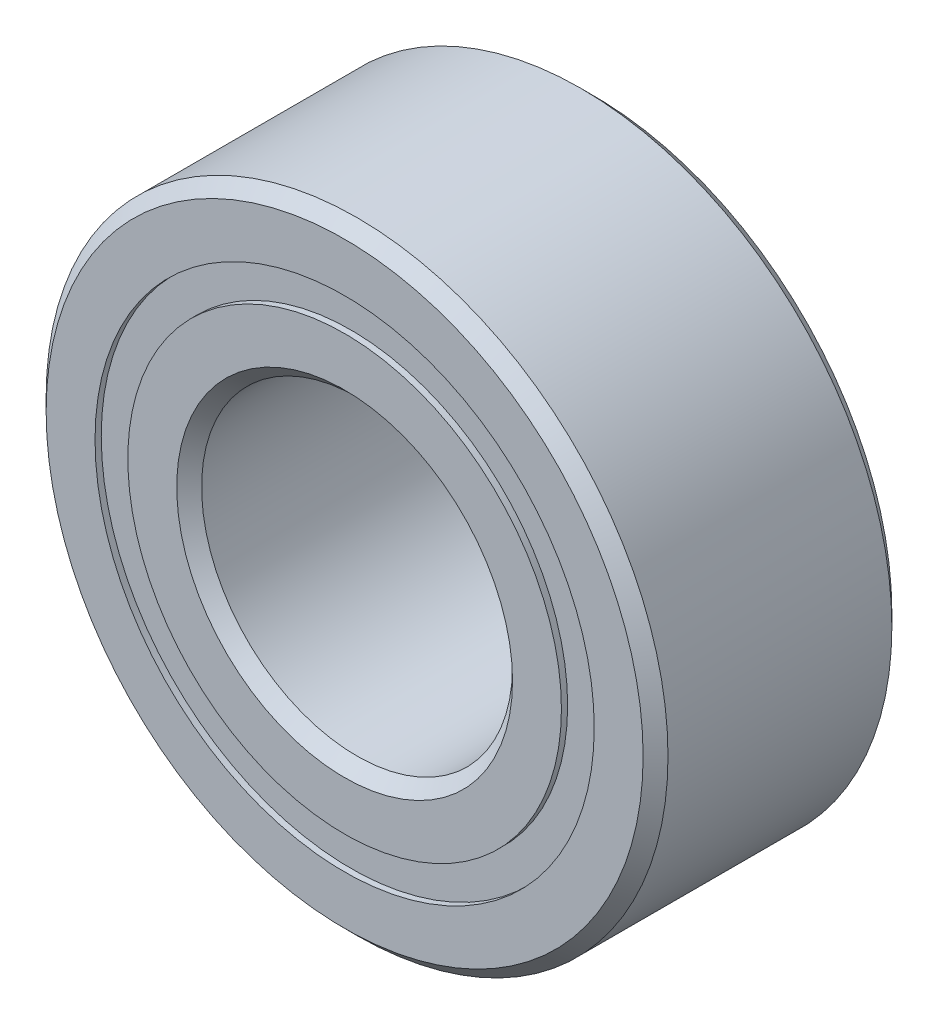
ISO-10303-21;
HEADER;
FILE_DESCRIPTION(('STEP AP214'),'2;1');
FILE_NAME('part.step','',(''),(''),'','','');
FILE_SCHEMA(('AUTOMOTIVE_DESIGN { 1 0 10303 214 1 1 1 1 }'));
ENDSEC;
DATA;
#1=APPLICATION_CONTEXT('core data for automotive mechanical design processes');
#2=APPLICATION_PROTOCOL_DEFINITION('international standard','automotive_design',2000,#1);
#3=PRODUCT_CONTEXT('',#1,'mechanical');
#4=PRODUCT('Part','Part','',(#3));
#5=PRODUCT_RELATED_PRODUCT_CATEGORY('part','',(#4));
#6=PRODUCT_DEFINITION_FORMATION('','',#4);
#7=PRODUCT_DEFINITION_CONTEXT('part definition',#1,'design');
#8=PRODUCT_DEFINITION('design','',#6,#7);
#9=PRODUCT_DEFINITION_SHAPE('','',#8);
#10=(LENGTH_UNIT() NAMED_UNIT(*) SI_UNIT(.MILLI.,.METRE.));
#11=(NAMED_UNIT(*) PLANE_ANGLE_UNIT() SI_UNIT($,.RADIAN.));
#12=(NAMED_UNIT(*) SI_UNIT($,.STERADIAN.) SOLID_ANGLE_UNIT());
#13=UNCERTAINTY_MEASURE_WITH_UNIT(LENGTH_MEASURE(1.E-05),#10,'distance_accuracy_value','');
#14=(GEOMETRIC_REPRESENTATION_CONTEXT(3) GLOBAL_UNCERTAINTY_ASSIGNED_CONTEXT((#13)) GLOBAL_UNIT_ASSIGNED_CONTEXT((#10,
#11,#12)) REPRESENTATION_CONTEXT('',''));
#15=CARTESIAN_POINT('',(0.,0.,0.));
#16=DIRECTION('',(0.,0.,1.));
#17=DIRECTION('',(1.,0.,0.));
#18=AXIS2_PLACEMENT_3D('',#15,#16,#17);
#19=CARTESIAN_POINT('',(0.,4.01373626373626,-1.9));
#20=DIRECTION('',(0.,0.,1.));
#21=DIRECTION('',(1.,0.,0.));
#22=AXIS2_PLACEMENT_3D('',#19,#20,#21);
#23=PLANE('',#22);
#24=CARTESIAN_POINT('',(0.,0.,-1.9));
#25=DIRECTION('',(0.,0.,1.));
#26=DIRECTION('',(1.,0.,0.));
#27=AXIS2_PLACEMENT_3D('',#24,#25,#26);
#28=CIRCLE('',#27,4.01373626373626);
#29=CARTESIAN_POINT('',(4.01373626373626,0.,-1.9));
#30=VERTEX_POINT('',#29);
#31=EDGE_CURVE('E57',#30,#30,#28,.T.);
#32=ORIENTED_EDGE('',*,*,#31,.F.);
#33=EDGE_LOOP('',(#32));
#34=FACE_BOUND('',#33,.T.);
#35=CARTESIAN_POINT('',(0.,0.,-1.9));
#36=DIRECTION('',(0.,0.,1.));
#37=DIRECTION('',(1.,0.,0.));
#38=AXIS2_PLACEMENT_3D('',#35,#36,#37);
#39=CIRCLE('',#38,3.48626373626374);
#40=CARTESIAN_POINT('',(3.48626373626374,0.,-1.9));
#41=VERTEX_POINT('',#40);
#42=EDGE_CURVE('E11',#41,#41,#39,.T.);
#43=ORIENTED_EDGE('',*,*,#42,.T.);
#44=EDGE_LOOP('',(#43));
#45=FACE_BOUND('',#44,.T.);
#46=ADVANCED_FACE('F43',(#34,#45),#23,.F.);
#47=CARTESIAN_POINT('',(0.,0.,2.));
#48=DIRECTION('',(0.,0.,1.));
#49=DIRECTION('',(1.,0.,0.));
#50=AXIS2_PLACEMENT_3D('',#47,#48,#49);
#51=CYLINDRICAL_SURFACE('',#50,3.48626373626374);
#52=ORIENTED_EDGE('',*,*,#42,.F.);
#53=EDGE_LOOP('',(#52));
#54=FACE_BOUND('',#53,.T.);
#55=CARTESIAN_POINT('',(0.,0.,-0.927189448602435));
#56=DIRECTION('',(0.,0.,1.));
#57=DIRECTION('',(1.,0.,0.));
#58=AXIS2_PLACEMENT_3D('',#55,#56,#57);
#59=CIRCLE('',#58,3.48626373626374);
#60=CARTESIAN_POINT('',(3.48626373626374,0.,-0.927189448602435));
#61=VERTEX_POINT('',#60);
#62=EDGE_CURVE('E49',#61,#61,#59,.T.);
#63=ORIENTED_EDGE('',*,*,#62,.T.);
#64=EDGE_LOOP('',(#63));
#65=FACE_BOUND('',#64,.T.);
#66=ADVANCED_FACE('F66',(#54,#65),#51,.F.);
#67=CARTESIAN_POINT('',(0.,4.01373626373626,-0.927189448602435));
#68=DIRECTION('',(0.,0.,-1.));
#69=DIRECTION('',(-1.,0.,0.));
#70=AXIS2_PLACEMENT_3D('',#67,#68,#69);
#71=PLANE('',#70);
#72=ORIENTED_EDGE('',*,*,#62,.F.);
#73=EDGE_LOOP('',(#72));
#74=FACE_BOUND('',#73,.T.);
#75=CARTESIAN_POINT('',(0.,0.,-0.927189448602435));
#76=DIRECTION('',(0.,0.,1.));
#77=DIRECTION('',(1.,0.,0.));
#78=AXIS2_PLACEMENT_3D('',#75,#76,#77);
#79=CIRCLE('',#78,4.01373626373626);
#80=CARTESIAN_POINT('',(4.01373626373626,0.,-0.927189448602435));
#81=VERTEX_POINT('',#80);
#82=EDGE_CURVE('E53',#81,#81,#79,.T.);
#83=ORIENTED_EDGE('',*,*,#82,.T.);
#84=EDGE_LOOP('',(#83));
#85=FACE_BOUND('',#84,.T.);
#86=ADVANCED_FACE('F70',(#74,#85),#71,.F.);
#87=CARTESIAN_POINT('',(0.,0.,2.));
#88=DIRECTION('',(0.,0.,1.));
#89=DIRECTION('',(1.,0.,0.));
#90=AXIS2_PLACEMENT_3D('',#87,#88,#89);
#91=CYLINDRICAL_SURFACE('',#90,4.01373626373626);
#92=ORIENTED_EDGE('',*,*,#82,.F.);
#93=EDGE_LOOP('',(#92));
#94=FACE_BOUND('',#93,.T.);
#95=ORIENTED_EDGE('',*,*,#31,.T.);
#96=EDGE_LOOP('',(#95));
#97=FACE_BOUND('',#96,.T.);
#98=ADVANCED_FACE('F63',(#94,#97),#91,.T.);
#99=CLOSED_SHELL('',(#46,#66,#86,#98));
#100=MANIFOLD_SOLID_BREP('B2',#99);
#101=CARTESIAN_POINT('',(0.,4.01373626373626,1.9));
#102=DIRECTION('',(0.,0.,-1.));
#103=DIRECTION('',(-1.,0.,0.));
#104=AXIS2_PLACEMENT_3D('',#101,#102,#103);
#105=PLANE('',#104);
#106=CARTESIAN_POINT('',(0.,0.,1.9));
#107=DIRECTION('',(0.,0.,1.));
#108=DIRECTION('',(1.,0.,0.));
#109=AXIS2_PLACEMENT_3D('',#106,#107,#108);
#110=CIRCLE('',#109,3.48626373626374);
#111=CARTESIAN_POINT('',(3.48626373626374,0.,1.9));
#112=VERTEX_POINT('',#111);
#113=EDGE_CURVE('E42',#112,#112,#110,.T.);
#114=ORIENTED_EDGE('',*,*,#113,.F.);
#115=EDGE_LOOP('',(#114));
#116=FACE_BOUND('',#115,.T.);
#117=CARTESIAN_POINT('',(0.,0.,1.9));
#118=DIRECTION('',(0.,0.,1.));
#119=DIRECTION('',(1.,0.,0.));
#120=AXIS2_PLACEMENT_3D('',#117,#118,#119);
#121=CIRCLE('',#120,4.01373626373626);
#122=CARTESIAN_POINT('',(4.01373626373626,0.,1.9));
#123=VERTEX_POINT('',#122);
#124=EDGE_CURVE('E124',#123,#123,#121,.T.);
#125=ORIENTED_EDGE('',*,*,#124,.T.);
#126=EDGE_LOOP('',(#125));
#127=FACE_BOUND('',#126,.T.);
#128=ADVANCED_FACE('F110',(#116,#127),#105,.F.);
#129=CARTESIAN_POINT('',(0.,0.,2.));
#130=DIRECTION('',(0.,0.,1.));
#131=DIRECTION('',(1.,0.,0.));
#132=AXIS2_PLACEMENT_3D('',#129,#130,#131);
#133=CYLINDRICAL_SURFACE('',#132,3.48626373626374);
#134=CARTESIAN_POINT('',(0.,0.,0.927189448602435));
#135=DIRECTION('',(0.,0.,1.));
#136=DIRECTION('',(1.,0.,0.));
#137=AXIS2_PLACEMENT_3D('',#134,#135,#136);
#138=CIRCLE('',#137,3.48626373626374);
#139=CARTESIAN_POINT('',(3.48626373626374,0.,0.927189448602435));
#140=VERTEX_POINT('',#139);
#141=EDGE_CURVE('E116',#140,#140,#138,.T.);
#142=ORIENTED_EDGE('',*,*,#141,.F.);
#143=EDGE_LOOP('',(#142));
#144=FACE_BOUND('',#143,.T.);
#145=ORIENTED_EDGE('',*,*,#113,.T.);
#146=EDGE_LOOP('',(#145));
#147=FACE_BOUND('',#146,.T.);
#148=ADVANCED_FACE('F139',(#144,#147),#133,.F.);
#149=CARTESIAN_POINT('',(0.,4.01373626373626,0.927189448602435));
#150=DIRECTION('',(0.,0.,1.));
#151=DIRECTION('',(1.,0.,0.));
#152=AXIS2_PLACEMENT_3D('',#149,#150,#151);
#153=PLANE('',#152);
#154=CARTESIAN_POINT('',(0.,0.,0.927189448602435));
#155=DIRECTION('',(0.,0.,1.));
#156=DIRECTION('',(1.,0.,0.));
#157=AXIS2_PLACEMENT_3D('',#154,#155,#156);
#158=CIRCLE('',#157,4.01373626373626);
#159=CARTESIAN_POINT('',(4.01373626373626,0.,0.927189448602435));
#160=VERTEX_POINT('',#159);
#161=EDGE_CURVE('E120',#160,#160,#158,.T.);
#162=ORIENTED_EDGE('',*,*,#161,.F.);
#163=EDGE_LOOP('',(#162));
#164=FACE_BOUND('',#163,.T.);
#165=ORIENTED_EDGE('',*,*,#141,.T.);
#166=EDGE_LOOP('',(#165));
#167=FACE_BOUND('',#166,.T.);
#168=ADVANCED_FACE('F134',(#164,#167),#153,.F.);
#169=CARTESIAN_POINT('',(0.,0.,2.));
#170=DIRECTION('',(0.,0.,1.));
#171=DIRECTION('',(1.,0.,0.));
#172=AXIS2_PLACEMENT_3D('',#169,#170,#171);
#173=CYLINDRICAL_SURFACE('',#172,4.01373626373626);
#174=ORIENTED_EDGE('',*,*,#124,.F.);
#175=EDGE_LOOP('',(#174));
#176=FACE_BOUND('',#175,.T.);
#177=ORIENTED_EDGE('',*,*,#161,.T.);
#178=EDGE_LOOP('',(#177));
#179=FACE_BOUND('',#178,.T.);
#180=ADVANCED_FACE('F131',(#176,#179),#173,.T.);
#181=CLOSED_SHELL('',(#128,#148,#168,#180));
#182=MANIFOLD_SOLID_BREP('B6',#181);
#183=CARTESIAN_POINT('',(-1.87499999999996,3.24759526419167,0.));
#184=DIRECTION('',(0.,0.,1.));
#185=DIRECTION('',(-0.499999999999989,0.866025403784445,0.));
#186=AXIS2_PLACEMENT_3D('',#183,#184,#185);
#187=SPHERICAL_SURFACE('',#186,0.927189448602435);
#188=CARTESIAN_POINT('',(-1.87499999999996,3.24759526419167,0.927189448602435));
#189=VERTEX_POINT('',#188);
#190=VERTEX_LOOP('',#189);
#191=FACE_BOUND('',#190,.T.);
#192=ADVANCED_FACE('F177',(#191),#187,.T.);
#193=CLOSED_SHELL('',(#192));
#194=MANIFOLD_SOLID_BREP('B37',#193);
#195=CARTESIAN_POINT('',(-3.24759526419162,1.87500000000004,0.));
#196=DIRECTION('',(0.,0.,1.));
#197=DIRECTION('',(-0.866025403784433,0.50000000000001,0.));
#198=AXIS2_PLACEMENT_3D('',#195,#196,#197);
#199=SPHERICAL_SURFACE('',#198,0.927189448602435);
#200=CARTESIAN_POINT('',(-3.24759526419162,1.87500000000004,0.927189448602435));
#201=VERTEX_POINT('',#200);
#202=VERTEX_LOOP('',#201);
#203=FACE_BOUND('',#202,.T.);
#204=ADVANCED_FACE('F197',(#203),#199,.T.);
#205=CLOSED_SHELL('',(#204));
#206=MANIFOLD_SOLID_BREP('B106',#205);
#207=CARTESIAN_POINT('',(-3.75,0.,0.));
#208=DIRECTION('',(0.,0.,1.));
#209=DIRECTION('',(-1.,0.,0.));
#210=AXIS2_PLACEMENT_3D('',#207,#208,#209);
#211=SPHERICAL_SURFACE('',#210,0.927189448602435);
#212=CARTESIAN_POINT('',(-3.75,0.,0.927189448602435));
#213=VERTEX_POINT('',#212);
#214=VERTEX_LOOP('',#213);
#215=FACE_BOUND('',#214,.T.);
#216=ADVANCED_FACE('F217',(#215),#211,.T.);
#217=CLOSED_SHELL('',(#216));
#218=MANIFOLD_SOLID_BREP('B173',#217);
#219=CARTESIAN_POINT('',(-3.24759526419166,-1.87499999999997,0.));
#220=DIRECTION('',(0.,0.,1.));
#221=DIRECTION('',(-0.866025403784443,-0.499999999999992,0.));
#222=AXIS2_PLACEMENT_3D('',#219,#220,#221);
#223=SPHERICAL_SURFACE('',#222,0.927189448602435);
#224=CARTESIAN_POINT('',(-3.24759526419166,-1.87499999999997,0.927189448602435));
#225=VERTEX_POINT('',#224);
#226=VERTEX_LOOP('',#225);
#227=FACE_BOUND('',#226,.T.);
#228=ADVANCED_FACE('F237',(#227),#223,.T.);
#229=CLOSED_SHELL('',(#228));
#230=MANIFOLD_SOLID_BREP('B193',#229);
#231=CARTESIAN_POINT('',(-1.87500000000003,-3.24759526419163,0.));
#232=DIRECTION('',(0.,0.,1.));
#233=DIRECTION('',(-0.500000000000007,-0.866025403784435,0.));
#234=AXIS2_PLACEMENT_3D('',#231,#232,#233);
#235=SPHERICAL_SURFACE('',#234,0.927189448602435);
#236=CARTESIAN_POINT('',(-1.87500000000003,-3.24759526419163,0.927189448602435));
#237=VERTEX_POINT('',#236);
#238=VERTEX_LOOP('',#237);
#239=FACE_BOUND('',#238,.T.);
#240=ADVANCED_FACE('F257',(#239),#235,.T.);
#241=CLOSED_SHELL('',(#240));
#242=MANIFOLD_SOLID_BREP('B213',#241);
#243=CARTESIAN_POINT('',(0.,-3.75,0.));
#244=DIRECTION('',(0.,0.,1.));
#245=DIRECTION('',(0.,-1.,0.));
#246=AXIS2_PLACEMENT_3D('',#243,#244,#245);
#247=SPHERICAL_SURFACE('',#246,0.927189448602435);
#248=CARTESIAN_POINT('',(0.,-3.75,0.927189448602435));
#249=VERTEX_POINT('',#248);
#250=VERTEX_LOOP('',#249);
#251=FACE_BOUND('',#250,.T.);
#252=ADVANCED_FACE('F277',(#251),#247,.T.);
#253=CLOSED_SHELL('',(#252));
#254=MANIFOLD_SOLID_BREP('B233',#253);
#255=CARTESIAN_POINT('',(1.87499999999998,-3.24759526419166,0.));
#256=DIRECTION('',(0.,0.,1.));
#257=DIRECTION('',(0.499999999999995,-0.866025403784442,0.));
#258=AXIS2_PLACEMENT_3D('',#255,#256,#257);
#259=SPHERICAL_SURFACE('',#258,0.927189448602435);
#260=CARTESIAN_POINT('',(1.87499999999998,-3.24759526419166,0.927189448602435));
#261=VERTEX_POINT('',#260);
#262=VERTEX_LOOP('',#261);
#263=FACE_BOUND('',#262,.T.);
#264=ADVANCED_FACE('F297',(#263),#259,.T.);
#265=CLOSED_SHELL('',(#264));
#266=MANIFOLD_SOLID_BREP('B253',#265);
#267=CARTESIAN_POINT('',(3.24759526419164,-1.87500000000002,0.));
#268=DIRECTION('',(0.,0.,1.));
#269=DIRECTION('',(0.866025403784436,-0.500000000000004,0.));
#270=AXIS2_PLACEMENT_3D('',#267,#268,#269);
#271=SPHERICAL_SURFACE('',#270,0.927189448602435);
#272=CARTESIAN_POINT('',(3.24759526419164,-1.87500000000002,0.927189448602435));
#273=VERTEX_POINT('',#272);
#274=VERTEX_LOOP('',#273);
#275=FACE_BOUND('',#274,.T.);
#276=ADVANCED_FACE('F317',(#275),#271,.T.);
#277=CLOSED_SHELL('',(#276));
#278=MANIFOLD_SOLID_BREP('B273',#277);
#279=CARTESIAN_POINT('',(3.75,0.,0.));
#280=DIRECTION('',(0.,0.,1.));
#281=DIRECTION('',(1.,0.,0.));
#282=AXIS2_PLACEMENT_3D('',#279,#280,#281);
#283=SPHERICAL_SURFACE('',#282,0.927189448602435);
#284=CARTESIAN_POINT('',(3.75,0.,0.927189448602435));
#285=VERTEX_POINT('',#284);
#286=VERTEX_LOOP('',#285);
#287=FACE_BOUND('',#286,.T.);
#288=ADVANCED_FACE('F337',(#287),#283,.T.);
#289=CLOSED_SHELL('',(#288));
#290=MANIFOLD_SOLID_BREP('B293',#289);
#291=CARTESIAN_POINT('',(3.24759526419165,1.87499999999999,0.));
#292=DIRECTION('',(0.,0.,1.));
#293=DIRECTION('',(0.86602540378444,0.499999999999998,0.));
#294=AXIS2_PLACEMENT_3D('',#291,#292,#293);
#295=SPHERICAL_SURFACE('',#294,0.927189448602435);
#296=CARTESIAN_POINT('',(3.24759526419165,1.87499999999999,0.927189448602435));
#297=VERTEX_POINT('',#296);
#298=VERTEX_LOOP('',#297);
#299=FACE_BOUND('',#298,.T.);
#300=ADVANCED_FACE('F357',(#299),#295,.T.);
#301=CLOSED_SHELL('',(#300));
#302=MANIFOLD_SOLID_BREP('B313',#301);
#303=CARTESIAN_POINT('',(1.875,3.24759526419164,0.));
#304=DIRECTION('',(0.,0.,1.));
#305=DIRECTION('',(0.500000000000001,0.866025403784438,0.));
#306=AXIS2_PLACEMENT_3D('',#303,#304,#305);
#307=SPHERICAL_SURFACE('',#306,0.927189448602435);
#308=CARTESIAN_POINT('',(1.875,3.24759526419164,0.927189448602435));
#309=VERTEX_POINT('',#308);
#310=VERTEX_LOOP('',#309);
#311=FACE_BOUND('',#310,.T.);
#312=ADVANCED_FACE('F377',(#311),#307,.T.);
#313=CLOSED_SHELL('',(#312));
#314=MANIFOLD_SOLID_BREP('B333',#313);
#315=CARTESIAN_POINT('',(0.,3.75,0.));
#316=DIRECTION('',(0.,0.,1.));
#317=DIRECTION('',(0.,1.,0.));
#318=AXIS2_PLACEMENT_3D('',#315,#316,#317);
#319=SPHERICAL_SURFACE('',#318,0.927189448602435);
#320=CARTESIAN_POINT('',(0.,3.75,0.927189448602435));
#321=VERTEX_POINT('',#320);
#322=VERTEX_LOOP('',#321);
#323=FACE_BOUND('',#322,.T.);
#324=ADVANCED_FACE('F399',(#323),#319,.T.);
#325=CLOSED_SHELL('',(#324));
#326=MANIFOLD_SOLID_BREP('B353',#325);
#327=CARTESIAN_POINT('',(0.,3.48626373626374,2.));
#328=DIRECTION('',(0.,0.,-1.));
#329=DIRECTION('',(-1.,0.,0.));
#330=AXIS2_PLACEMENT_3D('',#327,#328,#329);
#331=PLANE('',#330);
#332=CARTESIAN_POINT('',(0.,0.,2.));
#333=DIRECTION('',(0.,0.,1.));
#334=DIRECTION('',(1.,0.,0.));
#335=AXIS2_PLACEMENT_3D('',#332,#333,#334);
#336=CIRCLE('',#335,2.7);
#337=CARTESIAN_POINT('',(2.7,0.,2.));
#338=VERTEX_POINT('',#337);
#339=EDGE_CURVE('E446',#338,#338,#336,.T.);
#340=ORIENTED_EDGE('',*,*,#339,.F.);
#341=EDGE_LOOP('',(#340));
#342=FACE_BOUND('',#341,.T.);
#343=CARTESIAN_POINT('',(0.,0.,2.));
#344=DIRECTION('',(0.,0.,1.));
#345=DIRECTION('',(1.,0.,0.));
#346=AXIS2_PLACEMENT_3D('',#343,#344,#345);
#347=CIRCLE('',#346,3.48626373626374);
#348=CARTESIAN_POINT('',(3.48626373626374,0.,2.));
#349=VERTEX_POINT('',#348);
#350=EDGE_CURVE('E398',#349,#349,#347,.T.);
#351=ORIENTED_EDGE('',*,*,#350,.T.);
#352=EDGE_LOOP('',(#351));
#353=FACE_BOUND('',#352,.T.);
#354=ADVANCED_FACE('F418',(#342,#353),#331,.F.);
#355=CARTESIAN_POINT('',(0.,0.,2.));
#356=DIRECTION('',(0.,0.,1.));
#357=DIRECTION('',(1.,0.,0.));
#358=AXIS2_PLACEMENT_3D('',#355,#356,#357);
#359=CYLINDRICAL_SURFACE('',#358,3.48626373626374);
#360=ORIENTED_EDGE('',*,*,#350,.F.);
#361=EDGE_LOOP('',(#360));
#362=FACE_BOUND('',#361,.T.);
#363=CARTESIAN_POINT('',(0.,0.,0.888888888888889));
#364=DIRECTION('',(0.,0.,1.));
#365=DIRECTION('',(1.,0.,0.));
#366=AXIS2_PLACEMENT_3D('',#363,#364,#365);
#367=CIRCLE('',#366,3.48626373626374);
#368=CARTESIAN_POINT('',(3.48626373626374,0.,0.888888888888889));
#369=VERTEX_POINT('',#368);
#370=EDGE_CURVE('E424',#369,#369,#367,.T.);
#371=ORIENTED_EDGE('',*,*,#370,.T.);
#372=EDGE_LOOP('',(#371));
#373=FACE_BOUND('',#372,.T.);
#374=ADVANCED_FACE('F453',(#362,#373),#359,.T.);
#375=CARTESIAN_POINT('',(0.,0.,0.));
#376=DIRECTION('',(0.,0.,1.));
#377=DIRECTION('',(1.,0.,0.));
#378=AXIS2_PLACEMENT_3D('',#375,#376,#377);
#379=TOROIDAL_SURFACE('',#378,3.75,0.927189448602434);
#380=ORIENTED_EDGE('',*,*,#370,.F.);
#381=EDGE_LOOP('',(#380));
#382=FACE_BOUND('',#381,.T.);
#383=CARTESIAN_POINT('',(0.,0.,-0.88888888888889));
#384=DIRECTION('',(0.,0.,1.));
#385=DIRECTION('',(1.,0.,0.));
#386=AXIS2_PLACEMENT_3D('',#383,#384,#385);
#387=CIRCLE('',#386,3.48626373626374);
#388=CARTESIAN_POINT('',(3.48626373626374,0.,-0.88888888888889));
#389=VERTEX_POINT('',#388);
#390=EDGE_CURVE('E428',#389,#389,#387,.T.);
#391=ORIENTED_EDGE('',*,*,#390,.T.);
#392=EDGE_LOOP('',(#391));
#393=FACE_BOUND('',#392,.T.);
#394=ADVANCED_FACE('F457',(#382,#393),#379,.F.);
#395=CARTESIAN_POINT('',(0.,0.,2.));
#396=DIRECTION('',(0.,0.,1.));
#397=DIRECTION('',(1.,0.,0.));
#398=AXIS2_PLACEMENT_3D('',#395,#396,#397);
#399=CYLINDRICAL_SURFACE('',#398,3.48626373626374);
#400=ORIENTED_EDGE('',*,*,#390,.F.);
#401=EDGE_LOOP('',(#400));
#402=FACE_BOUND('',#401,.T.);
#403=CARTESIAN_POINT('',(0.,0.,-2.));
#404=DIRECTION('',(0.,0.,1.));
#405=DIRECTION('',(1.,0.,0.));
#406=AXIS2_PLACEMENT_3D('',#403,#404,#405);
#407=CIRCLE('',#406,3.48626373626374);
#408=CARTESIAN_POINT('',(3.48626373626374,0.,-2.));
#409=VERTEX_POINT('',#408);
#410=EDGE_CURVE('E432',#409,#409,#407,.T.);
#411=ORIENTED_EDGE('',*,*,#410,.T.);
#412=EDGE_LOOP('',(#411));
#413=FACE_BOUND('',#412,.T.);
#414=ADVANCED_FACE('F462',(#402,#413),#399,.T.);
#415=CARTESIAN_POINT('',(0.,2.7,-2.));
#416=DIRECTION('',(0.,0.,1.));
#417=DIRECTION('',(1.,0.,0.));
#418=AXIS2_PLACEMENT_3D('',#415,#416,#417);
#419=PLANE('',#418);
#420=ORIENTED_EDGE('',*,*,#410,.F.);
#421=EDGE_LOOP('',(#420));
#422=FACE_BOUND('',#421,.T.);
#423=CARTESIAN_POINT('',(0.,0.,-2.));
#424=DIRECTION('',(0.,0.,1.));
#425=DIRECTION('',(1.,0.,0.));
#426=AXIS2_PLACEMENT_3D('',#423,#424,#425);
#427=CIRCLE('',#426,2.7);
#428=CARTESIAN_POINT('',(2.7,0.,-2.));
#429=VERTEX_POINT('',#428);
#430=EDGE_CURVE('E437',#429,#429,#427,.T.);
#431=ORIENTED_EDGE('',*,*,#430,.T.);
#432=EDGE_LOOP('',(#431));
#433=FACE_BOUND('',#432,.T.);
#434=ADVANCED_FACE('F468',(#422,#433),#419,.F.);
#435=CARTESIAN_POINT('',(0.,0.,-1.8));
#436=DIRECTION('',(0.,0.,-1.));
#437=DIRECTION('',(-1.,0.,0.));
#438=AXIS2_PLACEMENT_3D('',#435,#436,#437);
#439=CONICAL_SURFACE('',#438,2.5,0.785398163397443);
#440=ORIENTED_EDGE('',*,*,#430,.F.);
#441=EDGE_LOOP('',(#440));
#442=FACE_BOUND('',#441,.T.);
#443=CARTESIAN_POINT('',(0.,0.,-1.8));
#444=DIRECTION('',(0.,0.,1.));
#445=DIRECTION('',(1.,0.,0.));
#446=AXIS2_PLACEMENT_3D('',#443,#444,#445);
#447=CIRCLE('',#446,2.5);
#448=CARTESIAN_POINT('',(2.5,0.,-1.8));
#449=VERTEX_POINT('',#448);
#450=EDGE_CURVE('E440',#449,#449,#447,.T.);
#451=ORIENTED_EDGE('',*,*,#450,.T.);
#452=EDGE_LOOP('',(#451));
#453=FACE_BOUND('',#452,.T.);
#454=ADVANCED_FACE('F472',(#442,#453),#439,.F.);
#455=CARTESIAN_POINT('',(0.,0.,2.));
#456=DIRECTION('',(0.,0.,1.));
#457=DIRECTION('',(1.,0.,0.));
#458=AXIS2_PLACEMENT_3D('',#455,#456,#457);
#459=CYLINDRICAL_SURFACE('',#458,2.5);
#460=ORIENTED_EDGE('',*,*,#450,.F.);
#461=EDGE_LOOP('',(#460));
#462=FACE_BOUND('',#461,.T.);
#463=CARTESIAN_POINT('',(0.,0.,1.8));
#464=DIRECTION('',(0.,0.,1.));
#465=DIRECTION('',(1.,0.,0.));
#466=AXIS2_PLACEMENT_3D('',#463,#464,#465);
#467=CIRCLE('',#466,2.5);
#468=CARTESIAN_POINT('',(2.5,0.,1.8));
#469=VERTEX_POINT('',#468);
#470=EDGE_CURVE('E443',#469,#469,#467,.T.);
#471=ORIENTED_EDGE('',*,*,#470,.T.);
#472=EDGE_LOOP('',(#471));
#473=FACE_BOUND('',#472,.T.);
#474=ADVANCED_FACE('F476',(#462,#473),#459,.F.);
#475=CARTESIAN_POINT('',(0.,0.,2.));
#476=DIRECTION('',(0.,0.,1.));
#477=DIRECTION('',(1.,0.,0.));
#478=AXIS2_PLACEMENT_3D('',#475,#476,#477);
#479=CONICAL_SURFACE('',#478,2.7,0.785398163397454);
#480=ORIENTED_EDGE('',*,*,#470,.F.);
#481=EDGE_LOOP('',(#480));
#482=FACE_BOUND('',#481,.T.);
#483=ORIENTED_EDGE('',*,*,#339,.T.);
#484=EDGE_LOOP('',(#483));
#485=FACE_BOUND('',#484,.T.);
#486=ADVANCED_FACE('F450',(#482,#485),#479,.F.);
#487=CLOSED_SHELL('',(#354,#374,#394,#414,#434,#454,#474,#486));
#488=MANIFOLD_SOLID_BREP('B373',#487);
#489=CARTESIAN_POINT('',(0.,0.,1.8));
#490=DIRECTION('',(0.,0.,-1.));
#491=DIRECTION('',(-1.,0.,0.));
#492=AXIS2_PLACEMENT_3D('',#489,#490,#491);
#493=CONICAL_SURFACE('',#492,5.,0.785398163397445);
#494=CARTESIAN_POINT('',(0.,0.,2.));
#495=DIRECTION('',(0.,0.,1.));
#496=DIRECTION('',(1.,0.,0.));
#497=AXIS2_PLACEMENT_3D('',#494,#495,#496);
#498=CIRCLE('',#497,4.8);
#499=CARTESIAN_POINT('',(4.8,0.,2.));
#500=VERTEX_POINT('',#499);
#501=EDGE_CURVE('E567',#500,#500,#498,.T.);
#502=ORIENTED_EDGE('',*,*,#501,.F.);
#503=EDGE_LOOP('',(#502));
#504=FACE_BOUND('',#503,.T.);
#505=CARTESIAN_POINT('',(0.,0.,1.8));
#506=DIRECTION('',(0.,0.,1.));
#507=DIRECTION('',(1.,0.,0.));
#508=AXIS2_PLACEMENT_3D('',#505,#506,#507);
#509=CIRCLE('',#508,5.);
#510=CARTESIAN_POINT('',(5.,0.,1.8));
#511=VERTEX_POINT('',#510);
#512=EDGE_CURVE('E417',#511,#511,#509,.T.);
#513=ORIENTED_EDGE('',*,*,#512,.T.);
#514=EDGE_LOOP('',(#513));
#515=FACE_BOUND('',#514,.T.);
#516=ADVANCED_FACE('F539',(#504,#515),#493,.T.);
#517=CARTESIAN_POINT('',(0.,0.,2.));
#518=DIRECTION('',(0.,0.,1.));
#519=DIRECTION('',(1.,0.,0.));
#520=AXIS2_PLACEMENT_3D('',#517,#518,#519);
#521=CYLINDRICAL_SURFACE('',#520,5.);
#522=ORIENTED_EDGE('',*,*,#512,.F.);
#523=EDGE_LOOP('',(#522));
#524=FACE_BOUND('',#523,.T.);
#525=CARTESIAN_POINT('',(0.,0.,-1.8));
#526=DIRECTION('',(0.,0.,1.));
#527=DIRECTION('',(1.,0.,0.));
#528=AXIS2_PLACEMENT_3D('',#525,#526,#527);
#529=CIRCLE('',#528,5.);
#530=CARTESIAN_POINT('',(5.,0.,-1.8));
#531=VERTEX_POINT('',#530);
#532=EDGE_CURVE('E545',#531,#531,#529,.T.);
#533=ORIENTED_EDGE('',*,*,#532,.T.);
#534=EDGE_LOOP('',(#533));
#535=FACE_BOUND('',#534,.T.);
#536=ADVANCED_FACE('F574',(#524,#535),#521,.T.);
#537=CARTESIAN_POINT('',(0.,0.,-2.));
#538=DIRECTION('',(0.,0.,1.));
#539=DIRECTION('',(1.,0.,0.));
#540=AXIS2_PLACEMENT_3D('',#537,#538,#539);
#541=CONICAL_SURFACE('',#540,4.8,0.785398163397444);
#542=ORIENTED_EDGE('',*,*,#532,.F.);
#543=EDGE_LOOP('',(#542));
#544=FACE_BOUND('',#543,.T.);
#545=CARTESIAN_POINT('',(0.,0.,-2.));
#546=DIRECTION('',(0.,0.,1.));
#547=DIRECTION('',(1.,0.,0.));
#548=AXIS2_PLACEMENT_3D('',#545,#546,#547);
#549=CIRCLE('',#548,4.8);
#550=CARTESIAN_POINT('',(4.8,0.,-2.));
#551=VERTEX_POINT('',#550);
#552=EDGE_CURVE('E549',#551,#551,#549,.T.);
#553=ORIENTED_EDGE('',*,*,#552,.T.);
#554=EDGE_LOOP('',(#553));
#555=FACE_BOUND('',#554,.T.);
#556=ADVANCED_FACE('F578',(#544,#555),#541,.T.);
#557=CARTESIAN_POINT('',(0.,4.8,-2.));
#558=DIRECTION('',(0.,0.,1.));
#559=DIRECTION('',(1.,0.,0.));
#560=AXIS2_PLACEMENT_3D('',#557,#558,#559);
#561=PLANE('',#560);
#562=ORIENTED_EDGE('',*,*,#552,.F.);
#563=EDGE_LOOP('',(#562));
#564=FACE_BOUND('',#563,.T.);
#565=CARTESIAN_POINT('',(0.,0.,-2.));
#566=DIRECTION('',(0.,0.,1.));
#567=DIRECTION('',(1.,0.,0.));
#568=AXIS2_PLACEMENT_3D('',#565,#566,#567);
#569=CIRCLE('',#568,4.01373626373626);
#570=CARTESIAN_POINT('',(4.01373626373626,0.,-2.));
#571=VERTEX_POINT('',#570);
#572=EDGE_CURVE('E553',#571,#571,#569,.T.);
#573=ORIENTED_EDGE('',*,*,#572,.T.);
#574=EDGE_LOOP('',(#573));
#575=FACE_BOUND('',#574,.T.);
#576=ADVANCED_FACE('F583',(#564,#575),#561,.F.);
#577=CARTESIAN_POINT('',(0.,0.,2.));
#578=DIRECTION('',(0.,0.,1.));
#579=DIRECTION('',(1.,0.,0.));
#580=AXIS2_PLACEMENT_3D('',#577,#578,#579);
#581=CYLINDRICAL_SURFACE('',#580,4.01373626373626);
#582=ORIENTED_EDGE('',*,*,#572,.F.);
#583=EDGE_LOOP('',(#582));
#584=FACE_BOUND('',#583,.T.);
#585=CARTESIAN_POINT('',(0.,0.,-0.888888888888889));
#586=DIRECTION('',(0.,0.,1.));
#587=DIRECTION('',(1.,0.,0.));
#588=AXIS2_PLACEMENT_3D('',#585,#586,#587);
#589=CIRCLE('',#588,4.01373626373626);
#590=CARTESIAN_POINT('',(4.01373626373626,0.,-0.888888888888889));
#591=VERTEX_POINT('',#590);
#592=EDGE_CURVE('E558',#591,#591,#589,.T.);
#593=ORIENTED_EDGE('',*,*,#592,.T.);
#594=EDGE_LOOP('',(#593));
#595=FACE_BOUND('',#594,.T.);
#596=ADVANCED_FACE('F589',(#584,#595),#581,.F.);
#597=CARTESIAN_POINT('',(0.,0.,0.));
#598=DIRECTION('',(0.,0.,1.));
#599=DIRECTION('',(1.,0.,0.));
#600=AXIS2_PLACEMENT_3D('',#597,#598,#599);
#601=TOROIDAL_SURFACE('',#600,3.75,0.927189448602435);
#602=ORIENTED_EDGE('',*,*,#592,.F.);
#603=EDGE_LOOP('',(#602));
#604=FACE_BOUND('',#603,.T.);
#605=CARTESIAN_POINT('',(0.,0.,0.888888888888889));
#606=DIRECTION('',(0.,0.,1.));
#607=DIRECTION('',(1.,0.,0.));
#608=AXIS2_PLACEMENT_3D('',#605,#606,#607);
#609=CIRCLE('',#608,4.01373626373626);
#610=CARTESIAN_POINT('',(4.01373626373626,0.,0.888888888888889));
#611=VERTEX_POINT('',#610);
#612=EDGE_CURVE('E561',#611,#611,#609,.T.);
#613=ORIENTED_EDGE('',*,*,#612,.T.);
#614=EDGE_LOOP('',(#613));
#615=FACE_BOUND('',#614,.T.);
#616=ADVANCED_FACE('F593',(#604,#615),#601,.F.);
#617=CARTESIAN_POINT('',(0.,0.,2.));
#618=DIRECTION('',(0.,0.,1.));
#619=DIRECTION('',(1.,0.,0.));
#620=AXIS2_PLACEMENT_3D('',#617,#618,#619);
#621=CYLINDRICAL_SURFACE('',#620,4.01373626373626);
#622=ORIENTED_EDGE('',*,*,#612,.F.);
#623=EDGE_LOOP('',(#622));
#624=FACE_BOUND('',#623,.T.);
#625=CARTESIAN_POINT('',(0.,0.,2.));
#626=DIRECTION('',(0.,0.,1.));
#627=DIRECTION('',(1.,0.,0.));
#628=AXIS2_PLACEMENT_3D('',#625,#626,#627);
#629=CIRCLE('',#628,4.01373626373626);
#630=CARTESIAN_POINT('',(4.01373626373626,0.,2.));
#631=VERTEX_POINT('',#630);
#632=EDGE_CURVE('E564',#631,#631,#629,.T.);
#633=ORIENTED_EDGE('',*,*,#632,.T.);
#634=EDGE_LOOP('',(#633));
#635=FACE_BOUND('',#634,.T.);
#636=ADVANCED_FACE('F597',(#624,#635),#621,.F.);
#637=CARTESIAN_POINT('',(0.,4.8,2.));
#638=DIRECTION('',(0.,0.,-1.));
#639=DIRECTION('',(-1.,0.,0.));
#640=AXIS2_PLACEMENT_3D('',#637,#638,#639);
#641=PLANE('',#640);
#642=ORIENTED_EDGE('',*,*,#632,.F.);
#643=EDGE_LOOP('',(#642));
#644=FACE_BOUND('',#643,.T.);
#645=ORIENTED_EDGE('',*,*,#501,.T.);
#646=EDGE_LOOP('',(#645));
#647=FACE_BOUND('',#646,.T.);
#648=ADVANCED_FACE('F571',(#644,#647),#641,.F.);
#649=CLOSED_SHELL('',(#516,#536,#556,#576,#596,#616,#636,#648));
#650=MANIFOLD_SOLID_BREP('B393',#649);
#651=ADVANCED_BREP_SHAPE_REPRESENTATION('',(#18,#100,#182,#194,#206,#218,#230,#242,#254,#266,
#278,#290,#302,#314,#326,#488,#650),#14);
#652=SHAPE_DEFINITION_REPRESENTATION(#9,#651);
ENDSEC;
END-ISO-10303-21;
